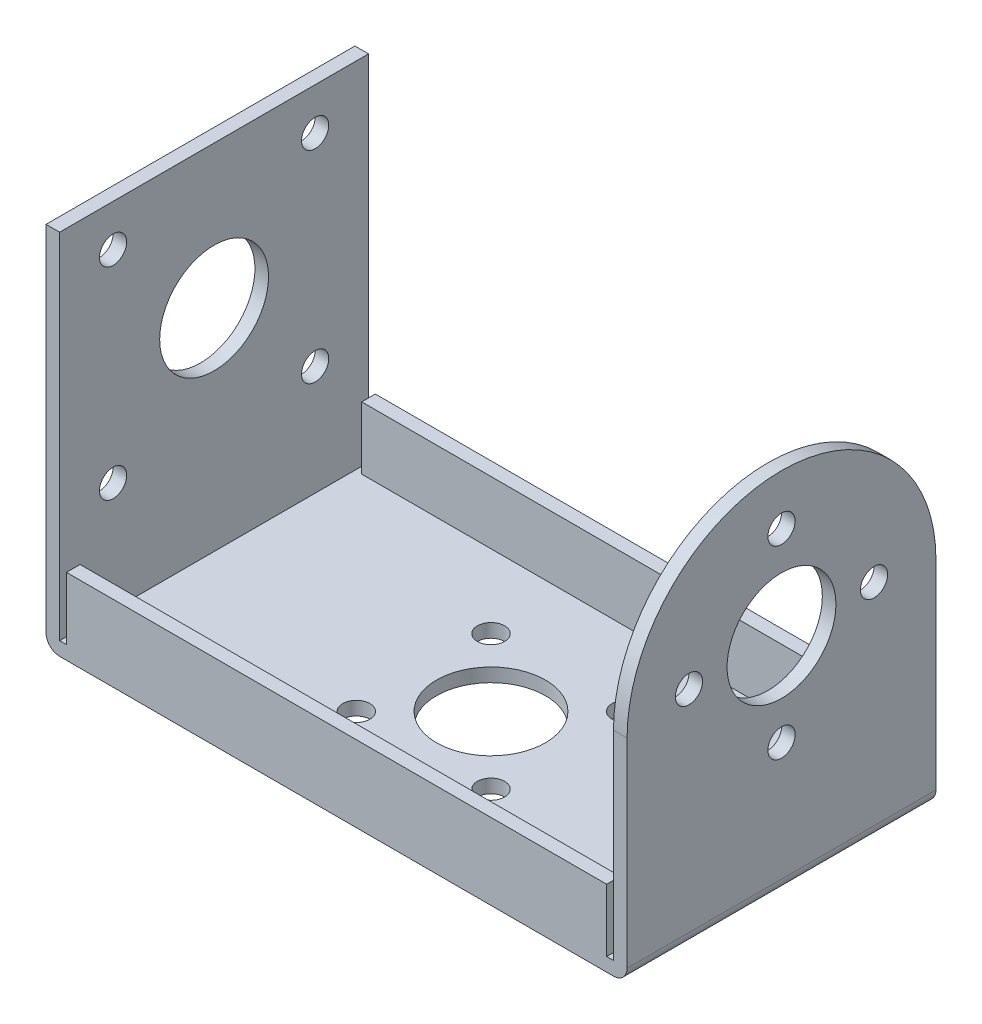
ISO-10303-21;
HEADER;
FILE_DESCRIPTION(('STEP AP214'),'2;1');
FILE_NAME('part.step','',(''),(''),'','','');
FILE_SCHEMA(('AUTOMOTIVE_DESIGN { 1 0 10303 214 1 1 1 1 }'));
ENDSEC;
DATA;
#1=APPLICATION_CONTEXT('core data for automotive mechanical design processes');
#2=APPLICATION_PROTOCOL_DEFINITION('international standard','automotive_design',2000,#1);
#3=PRODUCT_CONTEXT('',#1,'mechanical');
#4=PRODUCT('Part','Part','',(#3));
#5=PRODUCT_RELATED_PRODUCT_CATEGORY('part','',(#4));
#6=PRODUCT_DEFINITION_FORMATION('','',#4);
#7=PRODUCT_DEFINITION_CONTEXT('part definition',#1,'design');
#8=PRODUCT_DEFINITION('design','',#6,#7);
#9=PRODUCT_DEFINITION_SHAPE('','',#8);
#10=(LENGTH_UNIT() NAMED_UNIT(*) SI_UNIT(.MILLI.,.METRE.));
#11=(NAMED_UNIT(*) PLANE_ANGLE_UNIT() SI_UNIT($,.RADIAN.));
#12=(NAMED_UNIT(*) SI_UNIT($,.STERADIAN.) SOLID_ANGLE_UNIT());
#13=UNCERTAINTY_MEASURE_WITH_UNIT(LENGTH_MEASURE(1.E-05),#10,'distance_accuracy_value','');
#14=(GEOMETRIC_REPRESENTATION_CONTEXT(3) GLOBAL_UNCERTAINTY_ASSIGNED_CONTEXT((#13)) GLOBAL_UNIT_ASSIGNED_CONTEXT((#10,
#11,#12)) REPRESENTATION_CONTEXT('',''));
#15=CARTESIAN_POINT('',(0.,0.,0.));
#16=DIRECTION('',(0.,0.,1.));
#17=DIRECTION('',(1.,0.,0.));
#18=AXIS2_PLACEMENT_3D('',#15,#16,#17);
#19=CARTESIAN_POINT('',(42.7,1.,0.));
#20=DIRECTION('',(-1.,0.,0.));
#21=DIRECTION('',(0.,0.,1.));
#22=AXIS2_PLACEMENT_3D('',#19,#20,#21);
#23=PLANE('',#22);
#24=CARTESIAN_POINT('',(42.7,16.5,-4.5500000000001));
#25=DIRECTION('',(1.,0.,0.));
#26=DIRECTION('',(0.,0.,-1.));
#27=AXIS2_PLACEMENT_3D('',#24,#25,#26);
#28=CIRCLE('',#27,0.999999999999999);
#29=CARTESIAN_POINT('',(42.7,16.5,-5.55000000000009));
#30=VERTEX_POINT('',#29);
#31=EDGE_CURVE('E791',#30,#30,#28,.T.);
#32=ORIENTED_EDGE('',*,*,#31,.F.);
#33=EDGE_LOOP('',(#32));
#34=FACE_BOUND('',#33,.T.);
#35=CARTESIAN_POINT('',(42.7,9.7,-11.3500000000001));
#36=DIRECTION('',(1.,0.,0.));
#37=DIRECTION('',(0.,0.,-1.));
#38=AXIS2_PLACEMENT_3D('',#35,#36,#37);
#39=CIRCLE('',#38,1.);
#40=CARTESIAN_POINT('',(42.7,9.7,-12.3500000000001));
#41=VERTEX_POINT('',#40);
#42=EDGE_CURVE('E795',#41,#41,#39,.T.);
#43=ORIENTED_EDGE('',*,*,#42,.F.);
#44=EDGE_LOOP('',(#43));
#45=FACE_BOUND('',#44,.T.);
#46=CARTESIAN_POINT('',(42.7,23.3,-11.35));
#47=DIRECTION('',(1.,0.,0.));
#48=DIRECTION('',(0.,0.,-1.));
#49=AXIS2_PLACEMENT_3D('',#46,#47,#48);
#50=CIRCLE('',#49,1.);
#51=CARTESIAN_POINT('',(42.7,23.3,-12.35));
#52=VERTEX_POINT('',#51);
#53=EDGE_CURVE('E803',#52,#52,#50,.T.);
#54=ORIENTED_EDGE('',*,*,#53,.F.);
#55=EDGE_LOOP('',(#54));
#56=FACE_BOUND('',#55,.T.);
#57=CARTESIAN_POINT('',(42.7,16.5000000000001,-18.1500000000001));
#58=DIRECTION('',(1.,0.,0.));
#59=DIRECTION('',(0.,0.,-1.));
#60=AXIS2_PLACEMENT_3D('',#57,#58,#59);
#61=CIRCLE('',#60,1.);
#62=CARTESIAN_POINT('',(42.7,16.5000000000001,-19.1500000000001));
#63=VERTEX_POINT('',#62);
#64=EDGE_CURVE('E812',#63,#63,#61,.T.);
#65=ORIENTED_EDGE('',*,*,#64,.F.);
#66=EDGE_LOOP('',(#65));
#67=FACE_BOUND('',#66,.T.);
#68=CARTESIAN_POINT('',(42.7,16.5,-11.35));
#69=DIRECTION('',(1.,0.,0.));
#70=DIRECTION('',(0.,0.,-1.));
#71=AXIS2_PLACEMENT_3D('',#68,#69,#70);
#72=CIRCLE('',#71,4.);
#73=CARTESIAN_POINT('',(42.7,16.5,-15.35));
#74=VERTEX_POINT('',#73);
#75=EDGE_CURVE('E804',#74,#74,#72,.T.);
#76=ORIENTED_EDGE('',*,*,#75,.F.);
#77=EDGE_LOOP('',(#76));
#78=FACE_BOUND('',#77,.T.);
#79=DIRECTION('',(0.,-1.,0.));
#80=VECTOR('',#79,1.);
#81=CARTESIAN_POINT('',(42.7,1.,-22.7));
#82=LINE('',#81,#80);
#83=CARTESIAN_POINT('',(42.7,15.65,-22.7));
#84=VERTEX_POINT('',#83);
#85=CARTESIAN_POINT('',(42.7,1.,-22.7));
#86=VERTEX_POINT('',#85);
#87=EDGE_CURVE('E370',#84,#86,#82,.T.);
#88=ORIENTED_EDGE('',*,*,#87,.F.);
#89=CARTESIAN_POINT('',(42.7,15.65,-11.35));
#90=DIRECTION('',(1.,0.,0.));
#91=DIRECTION('',(0.,0.,-1.));
#92=AXIS2_PLACEMENT_3D('',#89,#90,#91);
#93=CIRCLE('',#92,11.35);
#94=CARTESIAN_POINT('',(42.7,15.65,0.));
#95=VERTEX_POINT('',#94);
#96=EDGE_CURVE('E256',#84,#95,#93,.T.);
#97=ORIENTED_EDGE('',*,*,#96,.T.);
#98=DIRECTION('',(0.,-1.,0.));
#99=VECTOR('',#98,1.);
#100=CARTESIAN_POINT('',(42.7,1.,0.));
#101=LINE('',#100,#99);
#102=CARTESIAN_POINT('',(42.7,1.,0.));
#103=VERTEX_POINT('',#102);
#104=EDGE_CURVE('E373',#95,#103,#101,.T.);
#105=ORIENTED_EDGE('',*,*,#104,.T.);
#106=DIRECTION('',(0.,0.,-1.));
#107=VECTOR('',#106,1.);
#108=CARTESIAN_POINT('',(42.7,1.,0.));
#109=LINE('',#108,#107);
#110=EDGE_CURVE('E380',#103,#86,#109,.T.);
#111=ORIENTED_EDGE('',*,*,#110,.T.);
#112=EDGE_LOOP('',(#88,#97,#105,#111));
#113=FACE_BOUND('',#112,.T.);
#114=ADVANCED_FACE('F117',(#34,#45,#56,#67,#78,#113),#23,.F.);
#115=CARTESIAN_POINT('',(41.7,27.,0.));
#116=DIRECTION('',(1.,0.,0.));
#117=DIRECTION('',(0.,0.,-1.));
#118=AXIS2_PLACEMENT_3D('',#115,#116,#117);
#119=PLANE('',#118);
#120=CARTESIAN_POINT('',(41.7,16.5,-4.5500000000001));
#121=DIRECTION('',(1.,0.,0.));
#122=DIRECTION('',(0.,0.,-1.));
#123=AXIS2_PLACEMENT_3D('',#120,#121,#122);
#124=CIRCLE('',#123,0.999999999999999);
#125=CARTESIAN_POINT('',(41.7,16.5,-5.55000000000009));
#126=VERTEX_POINT('',#125);
#127=EDGE_CURVE('E789',#126,#126,#124,.T.);
#128=ORIENTED_EDGE('',*,*,#127,.T.);
#129=EDGE_LOOP('',(#128));
#130=FACE_BOUND('',#129,.T.);
#131=CARTESIAN_POINT('',(41.7,9.7,-11.3500000000001));
#132=DIRECTION('',(1.,0.,0.));
#133=DIRECTION('',(0.,0.,-1.));
#134=AXIS2_PLACEMENT_3D('',#131,#132,#133);
#135=CIRCLE('',#134,1.);
#136=CARTESIAN_POINT('',(41.7,9.7,-12.3500000000001));
#137=VERTEX_POINT('',#136);
#138=EDGE_CURVE('E816',#137,#137,#135,.T.);
#139=ORIENTED_EDGE('',*,*,#138,.T.);
#140=EDGE_LOOP('',(#139));
#141=FACE_BOUND('',#140,.T.);
#142=CARTESIAN_POINT('',(41.7,23.3,-11.35));
#143=DIRECTION('',(1.,0.,0.));
#144=DIRECTION('',(0.,0.,-1.));
#145=AXIS2_PLACEMENT_3D('',#142,#143,#144);
#146=CIRCLE('',#145,1.);
#147=CARTESIAN_POINT('',(41.7,23.3,-12.35));
#148=VERTEX_POINT('',#147);
#149=EDGE_CURVE('E265',#148,#148,#146,.T.);
#150=ORIENTED_EDGE('',*,*,#149,.T.);
#151=EDGE_LOOP('',(#150));
#152=FACE_BOUND('',#151,.T.);
#153=CARTESIAN_POINT('',(41.7,16.5000000000001,-18.1500000000001));
#154=DIRECTION('',(1.,0.,0.));
#155=DIRECTION('',(0.,0.,-1.));
#156=AXIS2_PLACEMENT_3D('',#153,#154,#155);
#157=CIRCLE('',#156,1.);
#158=CARTESIAN_POINT('',(41.7,16.5000000000001,-19.1500000000001));
#159=VERTEX_POINT('',#158);
#160=EDGE_CURVE('E808',#159,#159,#157,.T.);
#161=ORIENTED_EDGE('',*,*,#160,.T.);
#162=EDGE_LOOP('',(#161));
#163=FACE_BOUND('',#162,.T.);
#164=CARTESIAN_POINT('',(41.7,16.5,-11.35));
#165=DIRECTION('',(1.,0.,0.));
#166=DIRECTION('',(0.,0.,-1.));
#167=AXIS2_PLACEMENT_3D('',#164,#165,#166);
#168=CIRCLE('',#167,4.);
#169=CARTESIAN_POINT('',(41.7,16.5,-15.35));
#170=VERTEX_POINT('',#169);
#171=EDGE_CURVE('E799',#170,#170,#168,.T.);
#172=ORIENTED_EDGE('',*,*,#171,.T.);
#173=EDGE_LOOP('',(#172));
#174=FACE_BOUND('',#173,.T.);
#175=CARTESIAN_POINT('',(41.7,15.65,-11.35));
#176=DIRECTION('',(1.,0.,0.));
#177=DIRECTION('',(0.,0.,-1.));
#178=AXIS2_PLACEMENT_3D('',#175,#176,#177);
#179=CIRCLE('',#178,11.35);
#180=CARTESIAN_POINT('',(41.7,15.65,-22.7));
#181=VERTEX_POINT('',#180);
#182=CARTESIAN_POINT('',(41.7,15.65,0.));
#183=VERTEX_POINT('',#182);
#184=EDGE_CURVE('E244',#181,#183,#179,.T.);
#185=ORIENTED_EDGE('',*,*,#184,.F.);
#186=DIRECTION('',(0.,-1.,0.));
#187=VECTOR('',#186,1.);
#188=CARTESIAN_POINT('',(41.7,27.,-22.7));
#189=LINE('',#188,#187);
#190=CARTESIAN_POINT('',(41.7,1.,-22.7));
#191=VERTEX_POINT('',#190);
#192=EDGE_CURVE('E249',#181,#191,#189,.T.);
#193=ORIENTED_EDGE('',*,*,#192,.T.);
#194=DIRECTION('',(0.,0.,1.));
#195=VECTOR('',#194,1.);
#196=CARTESIAN_POINT('',(41.7,1.,0.));
#197=LINE('',#196,#195);
#198=CARTESIAN_POINT('',(41.7,1.,0.));
#199=VERTEX_POINT('',#198);
#200=EDGE_CURVE('E276',#191,#199,#197,.T.);
#201=ORIENTED_EDGE('',*,*,#200,.T.);
#202=DIRECTION('',(0.,-1.,0.));
#203=VECTOR('',#202,1.);
#204=CARTESIAN_POINT('',(41.7,27.,0.));
#205=LINE('',#204,#203);
#206=EDGE_CURVE('E251',#183,#199,#205,.T.);
#207=ORIENTED_EDGE('',*,*,#206,.F.);
#208=EDGE_LOOP('',(#185,#193,#201,#207));
#209=FACE_BOUND('',#208,.T.);
#210=ADVANCED_FACE('F246',(#130,#141,#152,#163,#174,#209),#119,.F.);
#211=CARTESIAN_POINT('',(0.,1.,0.));
#212=DIRECTION('',(0.,0.,-1.));
#213=DIRECTION('',(-1.,0.,0.));
#214=AXIS2_PLACEMENT_3D('',#211,#212,#213);
#215=PLANE('',#214);
#216=DIRECTION('',(1.,0.,0.));
#217=VECTOR('',#216,1.);
#218=CARTESIAN_POINT('',(41.7,15.65,0.));
#219=LINE('',#218,#217);
#220=EDGE_CURVE('E255',#183,#95,#219,.T.);
#221=ORIENTED_EDGE('',*,*,#220,.F.);
#222=ORIENTED_EDGE('',*,*,#206,.T.);
#223=DIRECTION('',(1.,0.,0.));
#224=VECTOR('',#223,1.);
#225=CARTESIAN_POINT('',(0.,1.,0.));
#226=LINE('',#225,#224);
#227=CARTESIAN_POINT('',(41.2,1.,0.));
#228=VERTEX_POINT('',#227);
#229=EDGE_CURVE('E357',#228,#199,#226,.T.);
#230=ORIENTED_EDGE('',*,*,#229,.F.);
#231=DIRECTION('',(0.,-1.,0.));
#232=VECTOR('',#231,1.);
#233=CARTESIAN_POINT('',(41.2,5.6,0.));
#234=LINE('',#233,#232);
#235=CARTESIAN_POINT('',(41.2,5.6,0.));
#236=VERTEX_POINT('',#235);
#237=EDGE_CURVE('E464',#236,#228,#234,.T.);
#238=ORIENTED_EDGE('',*,*,#237,.F.);
#239=DIRECTION('',(1.,0.,0.));
#240=VECTOR('',#239,1.);
#241=CARTESIAN_POINT('',(1.5,5.6,0.));
#242=LINE('',#241,#240);
#243=CARTESIAN_POINT('',(1.5,5.6,0.));
#244=VERTEX_POINT('',#243);
#245=EDGE_CURVE('E468',#244,#236,#242,.T.);
#246=ORIENTED_EDGE('',*,*,#245,.F.);
#247=DIRECTION('',(0.,-1.,0.));
#248=VECTOR('',#247,1.);
#249=CARTESIAN_POINT('',(1.5,5.6,0.));
#250=LINE('',#249,#248);
#251=CARTESIAN_POINT('',(1.5,1.,0.));
#252=VERTEX_POINT('',#251);
#253=EDGE_CURVE('E460',#244,#252,#250,.T.);
#254=ORIENTED_EDGE('',*,*,#253,.T.);
#255=CARTESIAN_POINT('',(1.,1.,0.));
#256=VERTEX_POINT('',#255);
#257=EDGE_CURVE('E353',#256,#252,#226,.T.);
#258=ORIENTED_EDGE('',*,*,#257,.F.);
#259=DIRECTION('',(0.,-1.,0.));
#260=VECTOR('',#259,1.);
#261=CARTESIAN_POINT('',(1.,27.,0.));
#262=LINE('',#261,#260);
#263=CARTESIAN_POINT('',(1.,27.,0.));
#264=VERTEX_POINT('',#263);
#265=EDGE_CURVE('E308',#264,#256,#262,.T.);
#266=ORIENTED_EDGE('',*,*,#265,.F.);
#267=DIRECTION('',(1.,0.,0.));
#268=VECTOR('',#267,1.);
#269=CARTESIAN_POINT('',(1.,27.,0.));
#270=LINE('',#269,#268);
#271=CARTESIAN_POINT('',(0.,27.,0.));
#272=VERTEX_POINT('',#271);
#273=EDGE_CURVE('E286',#272,#264,#270,.T.);
#274=ORIENTED_EDGE('',*,*,#273,.F.);
#275=DIRECTION('',(0.,-1.,0.));
#276=VECTOR('',#275,1.);
#277=CARTESIAN_POINT('',(0.,1.,0.));
#278=LINE('',#277,#276);
#279=CARTESIAN_POINT('',(0.,1.,0.));
#280=VERTEX_POINT('',#279);
#281=EDGE_CURVE('E376',#272,#280,#278,.T.);
#282=ORIENTED_EDGE('',*,*,#281,.T.);
#283=CARTESIAN_POINT('',(1.,1.,0.));
#284=DIRECTION('',(0.,0.,-1.));
#285=DIRECTION('',(-1.,0.,0.));
#286=AXIS2_PLACEMENT_3D('',#283,#284,#285);
#287=CIRCLE('',#286,1.);
#288=CARTESIAN_POINT('',(1.,0.,0.));
#289=VERTEX_POINT('',#288);
#290=EDGE_CURVE('E133',#280,#289,#287,.F.);
#291=ORIENTED_EDGE('',*,*,#290,.T.);
#292=DIRECTION('',(1.,0.,0.));
#293=VECTOR('',#292,1.);
#294=CARTESIAN_POINT('',(0.,0.,0.));
#295=LINE('',#294,#293);
#296=CARTESIAN_POINT('',(41.7,0.,0.));
#297=VERTEX_POINT('',#296);
#298=EDGE_CURVE('E349',#289,#297,#295,.T.);
#299=ORIENTED_EDGE('',*,*,#298,.T.);
#300=CARTESIAN_POINT('',(41.7,1.,0.));
#301=DIRECTION('',(0.,0.,-1.));
#302=DIRECTION('',(-1.,0.,0.));
#303=AXIS2_PLACEMENT_3D('',#300,#301,#302);
#304=CIRCLE('',#303,1.);
#305=EDGE_CURVE('E126',#297,#103,#304,.F.);
#306=ORIENTED_EDGE('',*,*,#305,.T.);
#307=ORIENTED_EDGE('',*,*,#104,.F.);
#308=EDGE_LOOP('',(#221,#222,#230,#238,#246,#254,#258,#266,#274,#282,#291,#299,#306,#307));
#309=FACE_BOUND('',#308,.T.);
#310=ADVANCED_FACE('F402',(#309),#215,.F.);
#311=CARTESIAN_POINT('',(0.,1.,0.));
#312=DIRECTION('',(0.,1.,0.));
#313=DIRECTION('',(0.,0.,1.));
#314=AXIS2_PLACEMENT_3D('',#311,#312,#313);
#315=PLANE('',#314);
#316=CARTESIAN_POINT('',(16.4002525316942,1.,-6.40025253169409));
#317=DIRECTION('',(0.,1.,0.));
#318=DIRECTION('',(0.,0.,1.));
#319=AXIS2_PLACEMENT_3D('',#316,#317,#318);
#320=CIRCLE('',#319,1.);
#321=CARTESIAN_POINT('',(16.4002525316942,1.,-5.40025253169409));
#322=VERTEX_POINT('',#321);
#323=EDGE_CURVE('E321',#322,#322,#320,.T.);
#324=ORIENTED_EDGE('',*,*,#323,.F.);
#325=EDGE_LOOP('',(#324));
#326=FACE_BOUND('',#325,.T.);
#327=CARTESIAN_POINT('',(26.2997474683058,1.,-16.2997474683058));
#328=DIRECTION('',(0.,1.,0.));
#329=DIRECTION('',(0.,0.,1.));
#330=AXIS2_PLACEMENT_3D('',#327,#328,#329);
#331=CIRCLE('',#330,1.);
#332=CARTESIAN_POINT('',(26.2997474683058,1.,-15.2997474683058));
#333=VERTEX_POINT('',#332);
#334=EDGE_CURVE('E337',#333,#333,#331,.T.);
#335=ORIENTED_EDGE('',*,*,#334,.F.);
#336=EDGE_LOOP('',(#335));
#337=FACE_BOUND('',#336,.T.);
#338=CARTESIAN_POINT('',(21.35,1.,-11.35));
#339=DIRECTION('',(0.,1.,0.));
#340=DIRECTION('',(0.,0.,1.));
#341=AXIS2_PLACEMENT_3D('',#338,#339,#340);
#342=CIRCLE('',#341,4.);
#343=CARTESIAN_POINT('',(21.35,1.,-7.35));
#344=VERTEX_POINT('',#343);
#345=EDGE_CURVE('E345',#344,#344,#342,.T.);
#346=ORIENTED_EDGE('',*,*,#345,.F.);
#347=EDGE_LOOP('',(#346));
#348=FACE_BOUND('',#347,.T.);
#349=CARTESIAN_POINT('',(26.2997474683059,1.,-6.40025253169413));
#350=DIRECTION('',(0.,1.,0.));
#351=DIRECTION('',(0.,0.,1.));
#352=AXIS2_PLACEMENT_3D('',#349,#350,#351);
#353=CIRCLE('',#352,1.);
#354=CARTESIAN_POINT('',(26.2997474683059,1.,-5.40025253169412));
#355=VERTEX_POINT('',#354);
#356=EDGE_CURVE('E329',#355,#355,#353,.T.);
#357=ORIENTED_EDGE('',*,*,#356,.F.);
#358=EDGE_LOOP('',(#357));
#359=FACE_BOUND('',#358,.T.);
#360=CARTESIAN_POINT('',(16.4002525316942,1.,-16.2997474683058));
#361=DIRECTION('',(0.,1.,0.));
#362=DIRECTION('',(0.,0.,1.));
#363=AXIS2_PLACEMENT_3D('',#360,#361,#362);
#364=CIRCLE('',#363,1.);
#365=CARTESIAN_POINT('',(16.4002525316942,1.,-15.2997474683058));
#366=VERTEX_POINT('',#365);
#367=EDGE_CURVE('E313',#366,#366,#364,.T.);
#368=ORIENTED_EDGE('',*,*,#367,.F.);
#369=EDGE_LOOP('',(#368));
#370=FACE_BOUND('',#369,.T.);
#371=DIRECTION('',(-1.,0.,0.));
#372=VECTOR('',#371,1.);
#373=CARTESIAN_POINT('',(41.2,1.,-0.999999999999997));
#374=LINE('',#373,#372);
#375=CARTESIAN_POINT('',(41.2,1.,-0.999999999999997));
#376=VERTEX_POINT('',#375);
#377=CARTESIAN_POINT('',(1.5,1.,-0.999999999999997));
#378=VERTEX_POINT('',#377);
#379=EDGE_CURVE('E473',#376,#378,#374,.T.);
#380=ORIENTED_EDGE('',*,*,#379,.F.);
#381=DIRECTION('',(0.,0.,-1.));
#382=VECTOR('',#381,1.);
#383=CARTESIAN_POINT('',(41.2,1.,0.));
#384=LINE('',#383,#382);
#385=EDGE_CURVE('E478',#228,#376,#384,.T.);
#386=ORIENTED_EDGE('',*,*,#385,.F.);
#387=ORIENTED_EDGE('',*,*,#229,.T.);
#388=ORIENTED_EDGE('',*,*,#200,.F.);
#389=DIRECTION('',(-1.,0.,0.));
#390=VECTOR('',#389,1.);
#391=CARTESIAN_POINT('',(42.7,1.,-22.7));
#392=LINE('',#391,#390);
#393=CARTESIAN_POINT('',(41.2,1.,-22.7));
#394=VERTEX_POINT('',#393);
#395=EDGE_CURVE('E269',#191,#394,#392,.T.);
#396=ORIENTED_EDGE('',*,*,#395,.T.);
#397=DIRECTION('',(0.,0.,-1.));
#398=VECTOR('',#397,1.);
#399=CARTESIAN_POINT('',(41.2,1.,-22.7));
#400=LINE('',#399,#398);
#401=CARTESIAN_POINT('',(41.2,1.,-21.7));
#402=VERTEX_POINT('',#401);
#403=EDGE_CURVE('E499',#402,#394,#400,.T.);
#404=ORIENTED_EDGE('',*,*,#403,.F.);
#405=DIRECTION('',(1.,0.,0.));
#406=VECTOR('',#405,1.);
#407=CARTESIAN_POINT('',(41.2,1.,-21.7));
#408=LINE('',#407,#406);
#409=CARTESIAN_POINT('',(1.5,1.,-21.7));
#410=VERTEX_POINT('',#409);
#411=EDGE_CURVE('E512',#410,#402,#408,.T.);
#412=ORIENTED_EDGE('',*,*,#411,.F.);
#413=DIRECTION('',(0.,0.,1.));
#414=VECTOR('',#413,1.);
#415=CARTESIAN_POINT('',(1.5,1.,-21.7));
#416=LINE('',#415,#414);
#417=CARTESIAN_POINT('',(1.5,1.,-22.7));
#418=VERTEX_POINT('',#417);
#419=EDGE_CURVE('E482',#418,#410,#416,.T.);
#420=ORIENTED_EDGE('',*,*,#419,.F.);
#421=CARTESIAN_POINT('',(1.,1.,-22.7));
#422=VERTEX_POINT('',#421);
#423=EDGE_CURVE('E356',#418,#422,#392,.T.);
#424=ORIENTED_EDGE('',*,*,#423,.T.);
#425=DIRECTION('',(0.,0.,-1.));
#426=VECTOR('',#425,1.);
#427=CARTESIAN_POINT('',(1.,1.,-22.7));
#428=LINE('',#427,#426);
#429=EDGE_CURVE('E285',#256,#422,#428,.T.);
#430=ORIENTED_EDGE('',*,*,#429,.F.);
#431=ORIENTED_EDGE('',*,*,#257,.T.);
#432=DIRECTION('',(0.,0.,1.));
#433=VECTOR('',#432,1.);
#434=CARTESIAN_POINT('',(1.5,1.,-0.999999999999997));
#435=LINE('',#434,#433);
#436=EDGE_CURVE('E469',#378,#252,#435,.T.);
#437=ORIENTED_EDGE('',*,*,#436,.F.);
#438=EDGE_LOOP('',(#380,#386,#387,#388,#396,#404,#412,#420,#424,#430,#431,#437));
#439=FACE_BOUND('',#438,.T.);
#440=ADVANCED_FACE('F536',(#326,#337,#348,#359,#370,#439),#315,.T.);
#441=CARTESIAN_POINT('',(0.,0.,0.));
#442=DIRECTION('',(0.,1.,0.));
#443=DIRECTION('',(0.,0.,1.));
#444=AXIS2_PLACEMENT_3D('',#441,#442,#443);
#445=PLANE('',#444);
#446=DIRECTION('',(-1.,0.,0.));
#447=VECTOR('',#446,1.);
#448=CARTESIAN_POINT('',(42.7,0.,-22.7));
#449=LINE('',#448,#447);
#450=CARTESIAN_POINT('',(41.7,0.,-22.7));
#451=VERTEX_POINT('',#450);
#452=CARTESIAN_POINT('',(1.00000000000001,0.,-22.7));
#453=VERTEX_POINT('',#452);
#454=EDGE_CURVE('E363',#451,#453,#449,.T.);
#455=ORIENTED_EDGE('',*,*,#454,.F.);
#456=DIRECTION('',(0.,0.,-1.));
#457=VECTOR('',#456,1.);
#458=CARTESIAN_POINT('',(41.7,0.,0.));
#459=LINE('',#458,#457);
#460=EDGE_CURVE('E140',#451,#297,#459,.F.);
#461=ORIENTED_EDGE('',*,*,#460,.T.);
#462=ORIENTED_EDGE('',*,*,#298,.F.);
#463=DIRECTION('',(0.,0.,1.));
#464=VECTOR('',#463,1.);
#465=CARTESIAN_POINT('',(1.,0.,0.));
#466=LINE('',#465,#464);
#467=EDGE_CURVE('E390',#289,#453,#466,.F.);
#468=ORIENTED_EDGE('',*,*,#467,.T.);
#469=EDGE_LOOP('',(#455,#461,#462,#468));
#470=FACE_BOUND('',#469,.T.);
#471=CARTESIAN_POINT('',(21.35,0.,-11.35));
#472=DIRECTION('',(0.,1.,0.));
#473=DIRECTION('',(0.,0.,1.));
#474=AXIS2_PLACEMENT_3D('',#471,#472,#473);
#475=CIRCLE('',#474,4.);
#476=CARTESIAN_POINT('',(21.35,0.,-7.35));
#477=VERTEX_POINT('',#476);
#478=EDGE_CURVE('E341',#477,#477,#475,.T.);
#479=ORIENTED_EDGE('',*,*,#478,.T.);
#480=EDGE_LOOP('',(#479));
#481=FACE_BOUND('',#480,.T.);
#482=CARTESIAN_POINT('',(26.2997474683058,0.,-16.2997474683058));
#483=DIRECTION('',(0.,1.,0.));
#484=DIRECTION('',(0.,0.,1.));
#485=AXIS2_PLACEMENT_3D('',#482,#483,#484);
#486=CIRCLE('',#485,1.);
#487=CARTESIAN_POINT('',(26.2997474683058,0.,-15.2997474683058));
#488=VERTEX_POINT('',#487);
#489=EDGE_CURVE('E333',#488,#488,#486,.T.);
#490=ORIENTED_EDGE('',*,*,#489,.T.);
#491=EDGE_LOOP('',(#490));
#492=FACE_BOUND('',#491,.T.);
#493=CARTESIAN_POINT('',(26.2997474683059,0.,-6.40025253169413));
#494=DIRECTION('',(0.,1.,0.));
#495=DIRECTION('',(0.,0.,1.));
#496=AXIS2_PLACEMENT_3D('',#493,#494,#495);
#497=CIRCLE('',#496,1.);
#498=CARTESIAN_POINT('',(26.2997474683059,0.,-5.40025253169412));
#499=VERTEX_POINT('',#498);
#500=EDGE_CURVE('E325',#499,#499,#497,.T.);
#501=ORIENTED_EDGE('',*,*,#500,.T.);
#502=EDGE_LOOP('',(#501));
#503=FACE_BOUND('',#502,.T.);
#504=CARTESIAN_POINT('',(16.4002525316942,0.,-6.40025253169409));
#505=DIRECTION('',(0.,1.,0.));
#506=DIRECTION('',(0.,0.,1.));
#507=AXIS2_PLACEMENT_3D('',#504,#505,#506);
#508=CIRCLE('',#507,1.);
#509=CARTESIAN_POINT('',(16.4002525316942,0.,-5.40025253169409));
#510=VERTEX_POINT('',#509);
#511=EDGE_CURVE('E317',#510,#510,#508,.T.);
#512=ORIENTED_EDGE('',*,*,#511,.T.);
#513=EDGE_LOOP('',(#512));
#514=FACE_BOUND('',#513,.T.);
#515=CARTESIAN_POINT('',(16.4002525316942,0.,-16.2997474683058));
#516=DIRECTION('',(0.,1.,0.));
#517=DIRECTION('',(0.,0.,1.));
#518=AXIS2_PLACEMENT_3D('',#515,#516,#517);
#519=CIRCLE('',#518,1.);
#520=CARTESIAN_POINT('',(16.4002525316942,0.,-15.2997474683058));
#521=VERTEX_POINT('',#520);
#522=EDGE_CURVE('E312',#521,#521,#519,.T.);
#523=ORIENTED_EDGE('',*,*,#522,.T.);
#524=EDGE_LOOP('',(#523));
#525=FACE_BOUND('',#524,.T.);
#526=ADVANCED_FACE('F595',(#470,#481,#492,#503,#514,#525),#445,.F.);
#527=CARTESIAN_POINT('',(0.,1.,-22.7));
#528=DIRECTION('',(1.,0.,0.));
#529=DIRECTION('',(0.,0.,-1.));
#530=AXIS2_PLACEMENT_3D('',#527,#528,#529);
#531=PLANE('',#530);
#532=CARTESIAN_POINT('',(0.,9.07537879754109,-18.7746212024586));
#533=DIRECTION('',(-1.,0.,0.));
#534=DIRECTION('',(0.,0.,1.));
#535=AXIS2_PLACEMENT_3D('',#532,#533,#534);
#536=CIRCLE('',#535,1.);
#537=CARTESIAN_POINT('',(0.,9.07537879754109,-17.7746212024586));
#538=VERTEX_POINT('',#537);
#539=EDGE_CURVE('E438',#538,#538,#536,.T.);
#540=ORIENTED_EDGE('',*,*,#539,.F.);
#541=EDGE_LOOP('',(#540));
#542=FACE_BOUND('',#541,.T.);
#543=CARTESIAN_POINT('',(0.,9.07537879754124,-3.92537879754105));
#544=DIRECTION('',(-1.,0.,0.));
#545=DIRECTION('',(0.,0.,1.));
#546=AXIS2_PLACEMENT_3D('',#543,#544,#545);
#547=CIRCLE('',#546,1.);
#548=CARTESIAN_POINT('',(0.,9.07537879754124,-2.92537879754105));
#549=VERTEX_POINT('',#548);
#550=EDGE_CURVE('E430',#549,#549,#547,.T.);
#551=ORIENTED_EDGE('',*,*,#550,.F.);
#552=EDGE_LOOP('',(#551));
#553=FACE_BOUND('',#552,.T.);
#554=CARTESIAN_POINT('',(0.,23.9246212024588,-3.92537879754126));
#555=DIRECTION('',(-1.,0.,0.));
#556=DIRECTION('',(0.,0.,1.));
#557=AXIS2_PLACEMENT_3D('',#554,#555,#556);
#558=CIRCLE('',#557,1.);
#559=CARTESIAN_POINT('',(0.,23.9246212024588,-2.92537879754126));
#560=VERTEX_POINT('',#559);
#561=EDGE_CURVE('E422',#560,#560,#558,.T.);
#562=ORIENTED_EDGE('',*,*,#561,.F.);
#563=EDGE_LOOP('',(#562));
#564=FACE_BOUND('',#563,.T.);
#565=CARTESIAN_POINT('',(0.,23.9246212024586,-18.7746212024587));
#566=DIRECTION('',(-1.,0.,0.));
#567=DIRECTION('',(0.,0.,1.));
#568=AXIS2_PLACEMENT_3D('',#565,#566,#567);
#569=CIRCLE('',#568,0.999999999999999);
#570=CARTESIAN_POINT('',(0.,23.9246212024586,-17.7746212024587));
#571=VERTEX_POINT('',#570);
#572=EDGE_CURVE('E413',#571,#571,#569,.T.);
#573=ORIENTED_EDGE('',*,*,#572,.F.);
#574=EDGE_LOOP('',(#573));
#575=FACE_BOUND('',#574,.T.);
#576=CARTESIAN_POINT('',(0.,16.5,-11.35));
#577=DIRECTION('',(-1.,0.,0.));
#578=DIRECTION('',(0.,0.,1.));
#579=AXIS2_PLACEMENT_3D('',#576,#577,#578);
#580=CIRCLE('',#579,4.);
#581=CARTESIAN_POINT('',(0.,16.5,-7.35));
#582=VERTEX_POINT('',#581);
#583=EDGE_CURVE('E417',#582,#582,#580,.T.);
#584=ORIENTED_EDGE('',*,*,#583,.F.);
#585=EDGE_LOOP('',(#584));
#586=FACE_BOUND('',#585,.T.);
#587=DIRECTION('',(0.,-1.,0.));
#588=VECTOR('',#587,1.);
#589=CARTESIAN_POINT('',(0.,1.,-22.7));
#590=LINE('',#589,#588);
#591=CARTESIAN_POINT('',(0.,27.,-22.7));
#592=VERTEX_POINT('',#591);
#593=CARTESIAN_POINT('',(0.,1.,-22.7));
#594=VERTEX_POINT('',#593);
#595=EDGE_CURVE('E360',#592,#594,#590,.T.);
#596=ORIENTED_EDGE('',*,*,#595,.T.);
#597=DIRECTION('',(0.,0.,1.));
#598=VECTOR('',#597,1.);
#599=CARTESIAN_POINT('',(0.,1.,-22.7));
#600=LINE('',#599,#598);
#601=EDGE_CURVE('E12',#594,#280,#600,.T.);
#602=ORIENTED_EDGE('',*,*,#601,.T.);
#603=ORIENTED_EDGE('',*,*,#281,.F.);
#604=DIRECTION('',(0.,0.,1.));
#605=VECTOR('',#604,1.);
#606=CARTESIAN_POINT('',(0.,27.,0.));
#607=LINE('',#606,#605);
#608=EDGE_CURVE('E297',#592,#272,#607,.T.);
#609=ORIENTED_EDGE('',*,*,#608,.F.);
#610=EDGE_LOOP('',(#596,#602,#603,#609));
#611=FACE_BOUND('',#610,.T.);
#612=ADVANCED_FACE('F554',(#542,#553,#564,#575,#586,#611),#531,.F.);
#613=CARTESIAN_POINT('',(42.7,1.,-22.7));
#614=DIRECTION('',(0.,0.,1.));
#615=DIRECTION('',(1.,0.,0.));
#616=AXIS2_PLACEMENT_3D('',#613,#614,#615);
#617=PLANE('',#616);
#618=ORIENTED_EDGE('',*,*,#192,.F.);
#619=DIRECTION('',(1.,0.,0.));
#620=VECTOR('',#619,1.);
#621=CARTESIAN_POINT('',(41.7,15.65,-22.7));
#622=LINE('',#621,#620);
#623=EDGE_CURVE('E259',#181,#84,#622,.T.);
#624=ORIENTED_EDGE('',*,*,#623,.T.);
#625=ORIENTED_EDGE('',*,*,#87,.T.);
#626=CARTESIAN_POINT('',(41.7,1.,-22.7));
#627=DIRECTION('',(0.,0.,1.));
#628=DIRECTION('',(1.,0.,0.));
#629=AXIS2_PLACEMENT_3D('',#626,#627,#628);
#630=CIRCLE('',#629,1.);
#631=EDGE_CURVE('E387',#86,#451,#630,.F.);
#632=ORIENTED_EDGE('',*,*,#631,.T.);
#633=ORIENTED_EDGE('',*,*,#454,.T.);
#634=CARTESIAN_POINT('',(1.,1.,-22.7));
#635=DIRECTION('',(0.,0.,1.));
#636=DIRECTION('',(1.,0.,0.));
#637=AXIS2_PLACEMENT_3D('',#634,#635,#636);
#638=CIRCLE('',#637,1.);
#639=EDGE_CURVE('E384',#453,#594,#638,.F.);
#640=ORIENTED_EDGE('',*,*,#639,.T.);
#641=ORIENTED_EDGE('',*,*,#595,.F.);
#642=DIRECTION('',(-1.,0.,0.));
#643=VECTOR('',#642,1.);
#644=CARTESIAN_POINT('',(0.,27.,-22.7));
#645=LINE('',#644,#643);
#646=CARTESIAN_POINT('',(1.,27.,-22.7));
#647=VERTEX_POINT('',#646);
#648=EDGE_CURVE('E293',#647,#592,#645,.T.);
#649=ORIENTED_EDGE('',*,*,#648,.F.);
#650=DIRECTION('',(0.,-1.,0.));
#651=VECTOR('',#650,1.);
#652=CARTESIAN_POINT('',(1.,27.,-22.7));
#653=LINE('',#652,#651);
#654=EDGE_CURVE('E301',#647,#422,#653,.T.);
#655=ORIENTED_EDGE('',*,*,#654,.T.);
#656=ORIENTED_EDGE('',*,*,#423,.F.);
#657=DIRECTION('',(0.,-1.,0.));
#658=VECTOR('',#657,1.);
#659=CARTESIAN_POINT('',(1.5,5.6,-22.7));
#660=LINE('',#659,#658);
#661=CARTESIAN_POINT('',(1.5,5.6,-22.7));
#662=VERTEX_POINT('',#661);
#663=EDGE_CURVE('E508',#662,#418,#660,.T.);
#664=ORIENTED_EDGE('',*,*,#663,.F.);
#665=DIRECTION('',(-1.,0.,0.));
#666=VECTOR('',#665,1.);
#667=CARTESIAN_POINT('',(1.5,5.6,-22.7));
#668=LINE('',#667,#666);
#669=CARTESIAN_POINT('',(41.2,5.6,-22.7));
#670=VERTEX_POINT('',#669);
#671=EDGE_CURVE('E505',#670,#662,#668,.T.);
#672=ORIENTED_EDGE('',*,*,#671,.F.);
#673=DIRECTION('',(0.,-1.,0.));
#674=VECTOR('',#673,1.);
#675=CARTESIAN_POINT('',(41.2,5.6,-22.7));
#676=LINE('',#675,#674);
#677=EDGE_CURVE('E522',#670,#394,#676,.T.);
#678=ORIENTED_EDGE('',*,*,#677,.T.);
#679=ORIENTED_EDGE('',*,*,#395,.F.);
#680=EDGE_LOOP('',(#618,#624,#625,#632,#633,#640,#641,#649,#655,#656,#664,#672,#678,#679));
#681=FACE_BOUND('',#680,.T.);
#682=ADVANCED_FACE('F267',(#681),#617,.F.);
#683=CARTESIAN_POINT('',(21.35,1.,-11.35));
#684=DIRECTION('',(0.,-1.,0.));
#685=DIRECTION('',(0.,0.,-1.));
#686=AXIS2_PLACEMENT_3D('',#683,#684,#685);
#687=CYLINDRICAL_SURFACE('',#686,4.);
#688=ORIENTED_EDGE('',*,*,#345,.T.);
#689=EDGE_LOOP('',(#688));
#690=FACE_BOUND('',#689,.T.);
#691=ORIENTED_EDGE('',*,*,#478,.F.);
#692=EDGE_LOOP('',(#691));
#693=FACE_BOUND('',#692,.T.);
#694=ADVANCED_FACE('F602',(#690,#693),#687,.F.);
#695=CARTESIAN_POINT('',(26.2997474683058,1.,-16.2997474683058));
#696=DIRECTION('',(0.,-1.,0.));
#697=DIRECTION('',(0.,0.,-1.));
#698=AXIS2_PLACEMENT_3D('',#695,#696,#697);
#699=CYLINDRICAL_SURFACE('',#698,1.);
#700=ORIENTED_EDGE('',*,*,#334,.T.);
#701=EDGE_LOOP('',(#700));
#702=FACE_BOUND('',#701,.T.);
#703=ORIENTED_EDGE('',*,*,#489,.F.);
#704=EDGE_LOOP('',(#703));
#705=FACE_BOUND('',#704,.T.);
#706=ADVANCED_FACE('F916',(#702,#705),#699,.F.);
#707=CARTESIAN_POINT('',(26.2997474683059,1.,-6.40025253169413));
#708=DIRECTION('',(0.,-1.,0.));
#709=DIRECTION('',(0.,0.,-1.));
#710=AXIS2_PLACEMENT_3D('',#707,#708,#709);
#711=CYLINDRICAL_SURFACE('',#710,1.);
#712=ORIENTED_EDGE('',*,*,#356,.T.);
#713=EDGE_LOOP('',(#712));
#714=FACE_BOUND('',#713,.T.);
#715=ORIENTED_EDGE('',*,*,#500,.F.);
#716=EDGE_LOOP('',(#715));
#717=FACE_BOUND('',#716,.T.);
#718=ADVANCED_FACE('F912',(#714,#717),#711,.F.);
#719=CARTESIAN_POINT('',(16.4002525316942,1.,-6.40025253169409));
#720=DIRECTION('',(0.,-1.,0.));
#721=DIRECTION('',(0.,0.,-1.));
#722=AXIS2_PLACEMENT_3D('',#719,#720,#721);
#723=CYLINDRICAL_SURFACE('',#722,1.);
#724=ORIENTED_EDGE('',*,*,#323,.T.);
#725=EDGE_LOOP('',(#724));
#726=FACE_BOUND('',#725,.T.);
#727=ORIENTED_EDGE('',*,*,#511,.F.);
#728=EDGE_LOOP('',(#727));
#729=FACE_BOUND('',#728,.T.);
#730=ADVANCED_FACE('F908',(#726,#729),#723,.F.);
#731=CARTESIAN_POINT('',(16.4002525316942,1.,-16.2997474683058));
#732=DIRECTION('',(0.,-1.,0.));
#733=DIRECTION('',(0.,0.,-1.));
#734=AXIS2_PLACEMENT_3D('',#731,#732,#733);
#735=CYLINDRICAL_SURFACE('',#734,1.);
#736=ORIENTED_EDGE('',*,*,#367,.T.);
#737=EDGE_LOOP('',(#736));
#738=FACE_BOUND('',#737,.T.);
#739=ORIENTED_EDGE('',*,*,#522,.F.);
#740=EDGE_LOOP('',(#739));
#741=FACE_BOUND('',#740,.T.);
#742=ADVANCED_FACE('F904',(#738,#741),#735,.F.);
#743=CARTESIAN_POINT('',(1.,27.,-22.7));
#744=DIRECTION('',(-1.,0.,0.));
#745=DIRECTION('',(0.,0.,1.));
#746=AXIS2_PLACEMENT_3D('',#743,#744,#745);
#747=PLANE('',#746);
#748=CARTESIAN_POINT('',(1.,9.07537879754109,-18.7746212024586));
#749=DIRECTION('',(-1.,0.,0.));
#750=DIRECTION('',(0.,0.,1.));
#751=AXIS2_PLACEMENT_3D('',#748,#749,#750);
#752=CIRCLE('',#751,1.);
#753=CARTESIAN_POINT('',(1.,9.07537879754109,-17.7746212024586));
#754=VERTEX_POINT('',#753);
#755=EDGE_CURVE('E412',#754,#754,#752,.T.);
#756=ORIENTED_EDGE('',*,*,#755,.T.);
#757=EDGE_LOOP('',(#756));
#758=FACE_BOUND('',#757,.T.);
#759=CARTESIAN_POINT('',(1.,9.07537879754124,-3.92537879754105));
#760=DIRECTION('',(-1.,0.,0.));
#761=DIRECTION('',(0.,0.,1.));
#762=AXIS2_PLACEMENT_3D('',#759,#760,#761);
#763=CIRCLE('',#762,1.);
#764=CARTESIAN_POINT('',(1.,9.07537879754124,-2.92537879754105));
#765=VERTEX_POINT('',#764);
#766=EDGE_CURVE('E434',#765,#765,#763,.T.);
#767=ORIENTED_EDGE('',*,*,#766,.T.);
#768=EDGE_LOOP('',(#767));
#769=FACE_BOUND('',#768,.T.);
#770=CARTESIAN_POINT('',(1.,23.9246212024588,-3.92537879754126));
#771=DIRECTION('',(-1.,0.,0.));
#772=DIRECTION('',(0.,0.,1.));
#773=AXIS2_PLACEMENT_3D('',#770,#771,#772);
#774=CIRCLE('',#773,1.);
#775=CARTESIAN_POINT('',(1.,23.9246212024588,-2.92537879754126));
#776=VERTEX_POINT('',#775);
#777=EDGE_CURVE('E426',#776,#776,#774,.T.);
#778=ORIENTED_EDGE('',*,*,#777,.T.);
#779=EDGE_LOOP('',(#778));
#780=FACE_BOUND('',#779,.T.);
#781=CARTESIAN_POINT('',(1.,23.9246212024586,-18.7746212024587));
#782=DIRECTION('',(-1.,0.,0.));
#783=DIRECTION('',(0.,0.,1.));
#784=AXIS2_PLACEMENT_3D('',#781,#782,#783);
#785=CIRCLE('',#784,0.999999999999999);
#786=CARTESIAN_POINT('',(1.,23.9246212024586,-17.7746212024587));
#787=VERTEX_POINT('',#786);
#788=EDGE_CURVE('E418',#787,#787,#785,.T.);
#789=ORIENTED_EDGE('',*,*,#788,.T.);
#790=EDGE_LOOP('',(#789));
#791=FACE_BOUND('',#790,.T.);
#792=CARTESIAN_POINT('',(1.,16.5,-11.35));
#793=DIRECTION('',(-1.,0.,0.));
#794=DIRECTION('',(0.,0.,1.));
#795=AXIS2_PLACEMENT_3D('',#792,#793,#794);
#796=CIRCLE('',#795,4.);
#797=CARTESIAN_POINT('',(1.,16.5,-7.35));
#798=VERTEX_POINT('',#797);
#799=EDGE_CURVE('E445',#798,#798,#796,.T.);
#800=ORIENTED_EDGE('',*,*,#799,.T.);
#801=EDGE_LOOP('',(#800));
#802=FACE_BOUND('',#801,.T.);
#803=ORIENTED_EDGE('',*,*,#429,.T.);
#804=ORIENTED_EDGE('',*,*,#654,.F.);
#805=DIRECTION('',(0.,0.,-1.));
#806=VECTOR('',#805,1.);
#807=CARTESIAN_POINT('',(1.,27.,-22.7));
#808=LINE('',#807,#806);
#809=EDGE_CURVE('E290',#264,#647,#808,.T.);
#810=ORIENTED_EDGE('',*,*,#809,.F.);
#811=ORIENTED_EDGE('',*,*,#265,.T.);
#812=EDGE_LOOP('',(#803,#804,#810,#811));
#813=FACE_BOUND('',#812,.T.);
#814=ADVANCED_FACE('F546',(#758,#769,#780,#791,#802,#813),#747,.F.);
#815=CARTESIAN_POINT('',(0.,27.,0.));
#816=DIRECTION('',(0.,-1.,0.));
#817=DIRECTION('',(0.,0.,-1.));
#818=AXIS2_PLACEMENT_3D('',#815,#816,#817);
#819=PLANE('',#818);
#820=ORIENTED_EDGE('',*,*,#273,.T.);
#821=ORIENTED_EDGE('',*,*,#809,.T.);
#822=ORIENTED_EDGE('',*,*,#648,.T.);
#823=ORIENTED_EDGE('',*,*,#608,.T.);
#824=EDGE_LOOP('',(#820,#821,#822,#823));
#825=FACE_BOUND('',#824,.T.);
#826=ADVANCED_FACE('F551',(#825),#819,.F.);
#827=CARTESIAN_POINT('',(1.5,5.6,-21.7));
#828=DIRECTION('',(1.,0.,0.));
#829=DIRECTION('',(0.,0.,-1.));
#830=AXIS2_PLACEMENT_3D('',#827,#828,#829);
#831=PLANE('',#830);
#832=ORIENTED_EDGE('',*,*,#419,.T.);
#833=DIRECTION('',(0.,-1.,0.));
#834=VECTOR('',#833,1.);
#835=CARTESIAN_POINT('',(1.5,5.6,-21.7));
#836=LINE('',#835,#834);
#837=CARTESIAN_POINT('',(1.5,5.6,-21.7));
#838=VERTEX_POINT('',#837);
#839=EDGE_CURVE('E272',#838,#410,#836,.T.);
#840=ORIENTED_EDGE('',*,*,#839,.F.);
#841=DIRECTION('',(0.,0.,1.));
#842=VECTOR('',#841,1.);
#843=CARTESIAN_POINT('',(1.5,5.6,-21.7));
#844=LINE('',#843,#842);
#845=EDGE_CURVE('E494',#662,#838,#844,.T.);
#846=ORIENTED_EDGE('',*,*,#845,.F.);
#847=ORIENTED_EDGE('',*,*,#663,.T.);
#848=EDGE_LOOP('',(#832,#840,#846,#847));
#849=FACE_BOUND('',#848,.T.);
#850=ADVANCED_FACE('F862',(#849),#831,.F.);
#851=CARTESIAN_POINT('',(41.2,5.6,-21.7));
#852=DIRECTION('',(0.,0.,-1.));
#853=DIRECTION('',(-1.,0.,0.));
#854=AXIS2_PLACEMENT_3D('',#851,#852,#853);
#855=PLANE('',#854);
#856=ORIENTED_EDGE('',*,*,#411,.T.);
#857=DIRECTION('',(0.,-1.,0.));
#858=VECTOR('',#857,1.);
#859=CARTESIAN_POINT('',(41.2,5.6,-21.7));
#860=LINE('',#859,#858);
#861=CARTESIAN_POINT('',(41.2,5.6,-21.7));
#862=VERTEX_POINT('',#861);
#863=EDGE_CURVE('E279',#862,#402,#860,.T.);
#864=ORIENTED_EDGE('',*,*,#863,.F.);
#865=DIRECTION('',(1.,0.,0.));
#866=VECTOR('',#865,1.);
#867=CARTESIAN_POINT('',(41.2,5.6,-21.7));
#868=LINE('',#867,#866);
#869=EDGE_CURVE('E498',#838,#862,#868,.T.);
#870=ORIENTED_EDGE('',*,*,#869,.F.);
#871=ORIENTED_EDGE('',*,*,#839,.T.);
#872=EDGE_LOOP('',(#856,#864,#870,#871));
#873=FACE_BOUND('',#872,.T.);
#874=ADVANCED_FACE('F532',(#873),#855,.F.);
#875=CARTESIAN_POINT('',(41.2,5.6,-22.7));
#876=DIRECTION('',(-1.,0.,0.));
#877=DIRECTION('',(0.,0.,1.));
#878=AXIS2_PLACEMENT_3D('',#875,#876,#877);
#879=PLANE('',#878);
#880=ORIENTED_EDGE('',*,*,#403,.T.);
#881=ORIENTED_EDGE('',*,*,#677,.F.);
#882=DIRECTION('',(0.,0.,-1.));
#883=VECTOR('',#882,1.);
#884=CARTESIAN_POINT('',(41.2,5.6,-22.7));
#885=LINE('',#884,#883);
#886=EDGE_CURVE('E502',#862,#670,#885,.T.);
#887=ORIENTED_EDGE('',*,*,#886,.F.);
#888=ORIENTED_EDGE('',*,*,#863,.T.);
#889=EDGE_LOOP('',(#880,#881,#887,#888));
#890=FACE_BOUND('',#889,.T.);
#891=ADVANCED_FACE('F529',(#890),#879,.F.);
#892=CARTESIAN_POINT('',(0.,5.6,0.));
#893=DIRECTION('',(0.,-1.,0.));
#894=DIRECTION('',(0.,0.,-1.));
#895=AXIS2_PLACEMENT_3D('',#892,#893,#894);
#896=PLANE('',#895);
#897=ORIENTED_EDGE('',*,*,#845,.T.);
#898=ORIENTED_EDGE('',*,*,#869,.T.);
#899=ORIENTED_EDGE('',*,*,#886,.T.);
#900=ORIENTED_EDGE('',*,*,#671,.T.);
#901=EDGE_LOOP('',(#897,#898,#899,#900));
#902=FACE_BOUND('',#901,.T.);
#903=ADVANCED_FACE('F631',(#902),#896,.F.);
#904=CARTESIAN_POINT('',(41.2,5.6,0.));
#905=DIRECTION('',(-1.,0.,0.));
#906=DIRECTION('',(0.,0.,1.));
#907=AXIS2_PLACEMENT_3D('',#904,#905,#906);
#908=PLANE('',#907);
#909=ORIENTED_EDGE('',*,*,#385,.T.);
#910=DIRECTION('',(0.,-1.,0.));
#911=VECTOR('',#910,1.);
#912=CARTESIAN_POINT('',(41.2,5.6,-0.999999999999997));
#913=LINE('',#912,#911);
#914=CARTESIAN_POINT('',(41.2,5.6,-0.999999999999997));
#915=VERTEX_POINT('',#914);
#916=EDGE_CURVE('E449',#915,#376,#913,.T.);
#917=ORIENTED_EDGE('',*,*,#916,.F.);
#918=DIRECTION('',(0.,0.,-1.));
#919=VECTOR('',#918,1.);
#920=CARTESIAN_POINT('',(41.2,5.6,0.));
#921=LINE('',#920,#919);
#922=EDGE_CURVE('E474',#236,#915,#921,.T.);
#923=ORIENTED_EDGE('',*,*,#922,.F.);
#924=ORIENTED_EDGE('',*,*,#237,.T.);
#925=EDGE_LOOP('',(#909,#917,#923,#924));
#926=FACE_BOUND('',#925,.T.);
#927=ADVANCED_FACE('F566',(#926),#908,.F.);
#928=CARTESIAN_POINT('',(41.2,5.6,-0.999999999999997));
#929=DIRECTION('',(0.,0.,1.));
#930=DIRECTION('',(1.,0.,0.));
#931=AXIS2_PLACEMENT_3D('',#928,#929,#930);
#932=PLANE('',#931);
#933=ORIENTED_EDGE('',*,*,#379,.T.);
#934=DIRECTION('',(0.,-1.,0.));
#935=VECTOR('',#934,1.);
#936=CARTESIAN_POINT('',(1.5,5.6,-0.999999999999997));
#937=LINE('',#936,#935);
#938=CARTESIAN_POINT('',(1.5,5.6,-0.999999999999997));
#939=VERTEX_POINT('',#938);
#940=EDGE_CURVE('E456',#939,#378,#937,.T.);
#941=ORIENTED_EDGE('',*,*,#940,.F.);
#942=DIRECTION('',(-1.,0.,0.));
#943=VECTOR('',#942,1.);
#944=CARTESIAN_POINT('',(41.2,5.6,-0.999999999999997));
#945=LINE('',#944,#943);
#946=EDGE_CURVE('E488',#915,#939,#945,.T.);
#947=ORIENTED_EDGE('',*,*,#946,.F.);
#948=ORIENTED_EDGE('',*,*,#916,.T.);
#949=EDGE_LOOP('',(#933,#941,#947,#948));
#950=FACE_BOUND('',#949,.T.);
#951=ADVANCED_FACE('F562',(#950),#932,.F.);
#952=CARTESIAN_POINT('',(1.5,5.6,-0.999999999999997));
#953=DIRECTION('',(1.,0.,0.));
#954=DIRECTION('',(0.,0.,-1.));
#955=AXIS2_PLACEMENT_3D('',#952,#953,#954);
#956=PLANE('',#955);
#957=ORIENTED_EDGE('',*,*,#436,.T.);
#958=ORIENTED_EDGE('',*,*,#253,.F.);
#959=DIRECTION('',(0.,0.,1.));
#960=VECTOR('',#959,1.);
#961=CARTESIAN_POINT('',(1.5,5.6,-0.999999999999997));
#962=LINE('',#961,#960);
#963=EDGE_CURVE('E485',#939,#244,#962,.T.);
#964=ORIENTED_EDGE('',*,*,#963,.F.);
#965=ORIENTED_EDGE('',*,*,#940,.T.);
#966=EDGE_LOOP('',(#957,#958,#964,#965));
#967=FACE_BOUND('',#966,.T.);
#968=ADVANCED_FACE('F558',(#967),#956,.F.);
#969=CARTESIAN_POINT('',(0.,5.6,0.));
#970=DIRECTION('',(0.,1.,0.));
#971=DIRECTION('',(0.,0.,1.));
#972=AXIS2_PLACEMENT_3D('',#969,#970,#971);
#973=PLANE('',#972);
#974=ORIENTED_EDGE('',*,*,#922,.T.);
#975=ORIENTED_EDGE('',*,*,#946,.T.);
#976=ORIENTED_EDGE('',*,*,#963,.T.);
#977=ORIENTED_EDGE('',*,*,#245,.T.);
#978=EDGE_LOOP('',(#974,#975,#976,#977));
#979=FACE_BOUND('',#978,.T.);
#980=ADVANCED_FACE('F568',(#979),#973,.T.);
#981=CARTESIAN_POINT('',(41.7,1.,0.));
#982=DIRECTION('',(0.,0.,-1.));
#983=DIRECTION('',(-1.,0.,0.));
#984=AXIS2_PLACEMENT_3D('',#981,#982,#983);
#985=CYLINDRICAL_SURFACE('',#984,1.);
#986=ORIENTED_EDGE('',*,*,#305,.F.);
#987=ORIENTED_EDGE('',*,*,#460,.F.);
#988=ORIENTED_EDGE('',*,*,#631,.F.);
#989=ORIENTED_EDGE('',*,*,#110,.F.);
#990=EDGE_LOOP('',(#986,#987,#988,#989));
#991=FACE_BOUND('',#990,.T.);
#992=ADVANCED_FACE('F405',(#991),#985,.T.);
#993=CARTESIAN_POINT('',(1.,1.,-22.7));
#994=DIRECTION('',(0.,0.,1.));
#995=DIRECTION('',(1.,0.,0.));
#996=AXIS2_PLACEMENT_3D('',#993,#994,#995);
#997=CYLINDRICAL_SURFACE('',#996,1.);
#998=ORIENTED_EDGE('',*,*,#639,.F.);
#999=ORIENTED_EDGE('',*,*,#467,.F.);
#1000=ORIENTED_EDGE('',*,*,#290,.F.);
#1001=ORIENTED_EDGE('',*,*,#601,.F.);
#1002=EDGE_LOOP('',(#998,#999,#1000,#1001));
#1003=FACE_BOUND('',#1002,.T.);
#1004=ADVANCED_FACE('F119',(#1003),#997,.T.);
#1005=CARTESIAN_POINT('',(1.,16.5,-11.35));
#1006=DIRECTION('',(-1.,0.,0.));
#1007=DIRECTION('',(0.,0.,1.));
#1008=AXIS2_PLACEMENT_3D('',#1005,#1006,#1007);
#1009=CYLINDRICAL_SURFACE('',#1008,4.);
#1010=ORIENTED_EDGE('',*,*,#799,.F.);
#1011=EDGE_LOOP('',(#1010));
#1012=FACE_BOUND('',#1011,.T.);
#1013=ORIENTED_EDGE('',*,*,#583,.T.);
#1014=EDGE_LOOP('',(#1013));
#1015=FACE_BOUND('',#1014,.T.);
#1016=ADVANCED_FACE('F613',(#1012,#1015),#1009,.F.);
#1017=CARTESIAN_POINT('',(1.,23.9246212024586,-18.7746212024587));
#1018=DIRECTION('',(-1.,0.,0.));
#1019=DIRECTION('',(0.,0.,1.));
#1020=AXIS2_PLACEMENT_3D('',#1017,#1018,#1019);
#1021=CYLINDRICAL_SURFACE('',#1020,0.999999999999999);
#1022=ORIENTED_EDGE('',*,*,#788,.F.);
#1023=EDGE_LOOP('',(#1022));
#1024=FACE_BOUND('',#1023,.T.);
#1025=ORIENTED_EDGE('',*,*,#572,.T.);
#1026=EDGE_LOOP('',(#1025));
#1027=FACE_BOUND('',#1026,.T.);
#1028=ADVANCED_FACE('F615',(#1024,#1027),#1021,.F.);
#1029=CARTESIAN_POINT('',(1.,23.9246212024588,-3.92537879754126));
#1030=DIRECTION('',(-1.,0.,0.));
#1031=DIRECTION('',(0.,0.,1.));
#1032=AXIS2_PLACEMENT_3D('',#1029,#1030,#1031);
#1033=CYLINDRICAL_SURFACE('',#1032,1.);
#1034=ORIENTED_EDGE('',*,*,#777,.F.);
#1035=EDGE_LOOP('',(#1034));
#1036=FACE_BOUND('',#1035,.T.);
#1037=ORIENTED_EDGE('',*,*,#561,.T.);
#1038=EDGE_LOOP('',(#1037));
#1039=FACE_BOUND('',#1038,.T.);
#1040=ADVANCED_FACE('F621',(#1036,#1039),#1033,.F.);
#1041=CARTESIAN_POINT('',(1.,9.07537879754124,-3.92537879754105));
#1042=DIRECTION('',(-1.,0.,0.));
#1043=DIRECTION('',(0.,0.,1.));
#1044=AXIS2_PLACEMENT_3D('',#1041,#1042,#1043);
#1045=CYLINDRICAL_SURFACE('',#1044,1.);
#1046=ORIENTED_EDGE('',*,*,#766,.F.);
#1047=EDGE_LOOP('',(#1046));
#1048=FACE_BOUND('',#1047,.T.);
#1049=ORIENTED_EDGE('',*,*,#550,.T.);
#1050=EDGE_LOOP('',(#1049));
#1051=FACE_BOUND('',#1050,.T.);
#1052=ADVANCED_FACE('F679',(#1048,#1051),#1045,.F.);
#1053=CARTESIAN_POINT('',(1.,9.07537879754109,-18.7746212024586));
#1054=DIRECTION('',(-1.,0.,0.));
#1055=DIRECTION('',(0.,0.,1.));
#1056=AXIS2_PLACEMENT_3D('',#1053,#1054,#1055);
#1057=CYLINDRICAL_SURFACE('',#1056,1.);
#1058=ORIENTED_EDGE('',*,*,#755,.F.);
#1059=EDGE_LOOP('',(#1058));
#1060=FACE_BOUND('',#1059,.T.);
#1061=ORIENTED_EDGE('',*,*,#539,.T.);
#1062=EDGE_LOOP('',(#1061));
#1063=FACE_BOUND('',#1062,.T.);
#1064=ADVANCED_FACE('F627',(#1060,#1063),#1057,.F.);
#1065=CARTESIAN_POINT('',(41.7,15.65,-11.35));
#1066=DIRECTION('',(1.,0.,0.));
#1067=DIRECTION('',(0.,0.,-1.));
#1068=AXIS2_PLACEMENT_3D('',#1065,#1066,#1067);
#1069=CYLINDRICAL_SURFACE('',#1068,11.35);
#1070=ORIENTED_EDGE('',*,*,#96,.F.);
#1071=ORIENTED_EDGE('',*,*,#623,.F.);
#1072=ORIENTED_EDGE('',*,*,#184,.T.);
#1073=ORIENTED_EDGE('',*,*,#220,.T.);
#1074=EDGE_LOOP('',(#1070,#1071,#1072,#1073));
#1075=FACE_BOUND('',#1074,.T.);
#1076=ADVANCED_FACE('F260',(#1075),#1069,.T.);
#1077=CARTESIAN_POINT('',(41.7,16.5000000000001,-18.1500000000001));
#1078=DIRECTION('',(1.,0.,0.));
#1079=DIRECTION('',(0.,0.,-1.));
#1080=AXIS2_PLACEMENT_3D('',#1077,#1078,#1079);
#1081=CYLINDRICAL_SURFACE('',#1080,1.);
#1082=ORIENTED_EDGE('',*,*,#160,.F.);
#1083=EDGE_LOOP('',(#1082));
#1084=FACE_BOUND('',#1083,.T.);
#1085=ORIENTED_EDGE('',*,*,#64,.T.);
#1086=EDGE_LOOP('',(#1085));
#1087=FACE_BOUND('',#1086,.T.);
#1088=ADVANCED_FACE('F731',(#1084,#1087),#1081,.F.);
#1089=CARTESIAN_POINT('',(41.7,16.5,-11.35));
#1090=DIRECTION('',(1.,0.,0.));
#1091=DIRECTION('',(0.,0.,-1.));
#1092=AXIS2_PLACEMENT_3D('',#1089,#1090,#1091);
#1093=CYLINDRICAL_SURFACE('',#1092,4.);
#1094=ORIENTED_EDGE('',*,*,#171,.F.);
#1095=EDGE_LOOP('',(#1094));
#1096=FACE_BOUND('',#1095,.T.);
#1097=ORIENTED_EDGE('',*,*,#75,.T.);
#1098=EDGE_LOOP('',(#1097));
#1099=FACE_BOUND('',#1098,.T.);
#1100=ADVANCED_FACE('F743',(#1096,#1099),#1093,.F.);
#1101=CARTESIAN_POINT('',(41.7,23.3,-11.35));
#1102=DIRECTION('',(1.,0.,0.));
#1103=DIRECTION('',(0.,0.,-1.));
#1104=AXIS2_PLACEMENT_3D('',#1101,#1102,#1103);
#1105=CYLINDRICAL_SURFACE('',#1104,1.);
#1106=ORIENTED_EDGE('',*,*,#149,.F.);
#1107=EDGE_LOOP('',(#1106));
#1108=FACE_BOUND('',#1107,.T.);
#1109=ORIENTED_EDGE('',*,*,#53,.T.);
#1110=EDGE_LOOP('',(#1109));
#1111=FACE_BOUND('',#1110,.T.);
#1112=ADVANCED_FACE('F753',(#1108,#1111),#1105,.F.);
#1113=CARTESIAN_POINT('',(41.7,9.7,-11.3500000000001));
#1114=DIRECTION('',(1.,0.,0.));
#1115=DIRECTION('',(0.,0.,-1.));
#1116=AXIS2_PLACEMENT_3D('',#1113,#1114,#1115);
#1117=CYLINDRICAL_SURFACE('',#1116,1.);
#1118=ORIENTED_EDGE('',*,*,#138,.F.);
#1119=EDGE_LOOP('',(#1118));
#1120=FACE_BOUND('',#1119,.T.);
#1121=ORIENTED_EDGE('',*,*,#42,.T.);
#1122=EDGE_LOOP('',(#1121));
#1123=FACE_BOUND('',#1122,.T.);
#1124=ADVANCED_FACE('F763',(#1120,#1123),#1117,.F.);
#1125=CARTESIAN_POINT('',(41.7,16.5,-4.5500000000001));
#1126=DIRECTION('',(1.,0.,0.));
#1127=DIRECTION('',(0.,0.,-1.));
#1128=AXIS2_PLACEMENT_3D('',#1125,#1126,#1127);
#1129=CYLINDRICAL_SURFACE('',#1128,0.999999999999999);
#1130=ORIENTED_EDGE('',*,*,#127,.F.);
#1131=EDGE_LOOP('',(#1130));
#1132=FACE_BOUND('',#1131,.T.);
#1133=ORIENTED_EDGE('',*,*,#31,.T.);
#1134=EDGE_LOOP('',(#1133));
#1135=FACE_BOUND('',#1134,.T.);
#1136=ADVANCED_FACE('F773',(#1132,#1135),#1129,.F.);
#1137=CLOSED_SHELL('',(#114,#210,#310,#440,#526,#612,#682,#694,#706,#718,#730,#742,#814,#826,
#850,#874,#891,#903,#927,#951,#968,#980,#992,#1004,#1016,#1028,#1040,#1052,#1064,#1076,#1088,
#1100,#1112,#1124,#1136));
#1138=MANIFOLD_SOLID_BREP('B2',#1137);
#1139=ADVANCED_BREP_SHAPE_REPRESENTATION('',(#18,#1138),#14);
#1140=SHAPE_DEFINITION_REPRESENTATION(#9,#1139);
ENDSEC;
END-ISO-10303-21;
